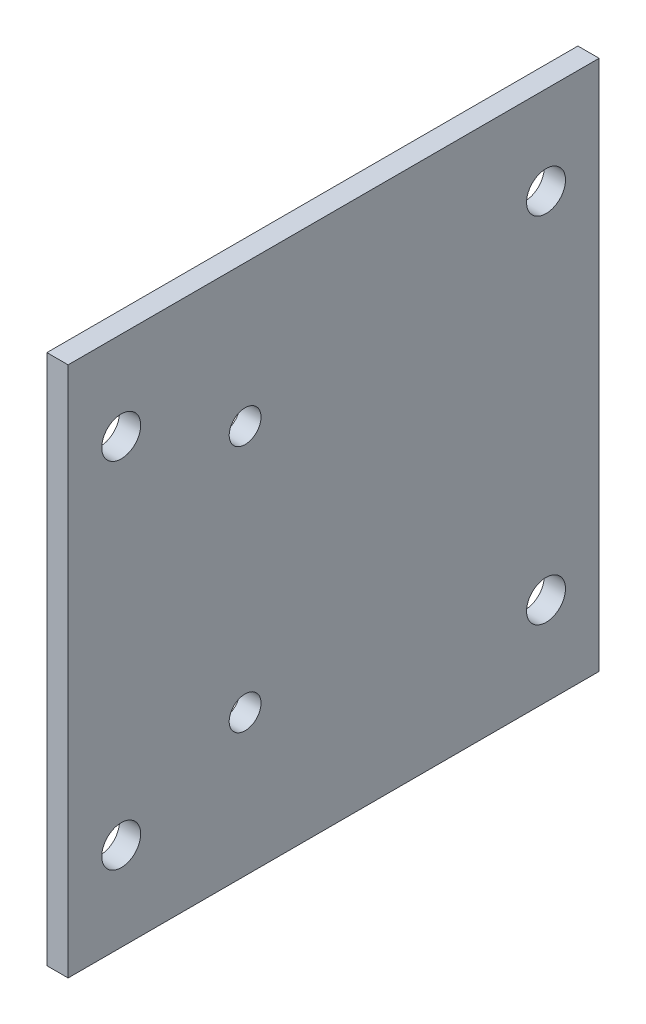
ISO-10303-21;
HEADER;
FILE_DESCRIPTION(('STEP AP214'),'2;1');
FILE_NAME('part.step','',(''),(''),'','','');
FILE_SCHEMA(('AUTOMOTIVE_DESIGN { 1 0 10303 214 1 1 1 1 }'));
ENDSEC;
DATA;
#1=APPLICATION_CONTEXT('core data for automotive mechanical design processes');
#2=APPLICATION_PROTOCOL_DEFINITION('international standard','automotive_design',2000,#1);
#3=PRODUCT_CONTEXT('',#1,'mechanical');
#4=PRODUCT('Part','Part','',(#3));
#5=PRODUCT_RELATED_PRODUCT_CATEGORY('part','',(#4));
#6=PRODUCT_DEFINITION_FORMATION('','',#4);
#7=PRODUCT_DEFINITION_CONTEXT('part definition',#1,'design');
#8=PRODUCT_DEFINITION('design','',#6,#7);
#9=PRODUCT_DEFINITION_SHAPE('','',#8);
#10=(LENGTH_UNIT() NAMED_UNIT(*) SI_UNIT(.MILLI.,.METRE.));
#11=(NAMED_UNIT(*) PLANE_ANGLE_UNIT() SI_UNIT($,.RADIAN.));
#12=(NAMED_UNIT(*) SI_UNIT($,.STERADIAN.) SOLID_ANGLE_UNIT());
#13=UNCERTAINTY_MEASURE_WITH_UNIT(LENGTH_MEASURE(1.E-05),#10,'distance_accuracy_value','');
#14=(GEOMETRIC_REPRESENTATION_CONTEXT(3) GLOBAL_UNCERTAINTY_ASSIGNED_CONTEXT((#13)) GLOBAL_UNIT_ASSIGNED_CONTEXT((#10,
#11,#12)) REPRESENTATION_CONTEXT('',''));
#15=CARTESIAN_POINT('',(0.,0.,0.));
#16=DIRECTION('',(0.,0.,1.));
#17=DIRECTION('',(1.,0.,0.));
#18=AXIS2_PLACEMENT_3D('',#15,#16,#17);
#19=CARTESIAN_POINT('',(3.,0.,0.));
#20=DIRECTION('',(-1.,0.,0.));
#21=DIRECTION('',(0.,0.,1.));
#22=AXIS2_PLACEMENT_3D('',#19,#20,#21);
#23=PLANE('',#22);
#24=DIRECTION('',(0.,1.,0.));
#25=VECTOR('',#24,1.);
#26=CARTESIAN_POINT('',(3.,107.5,-87.5));
#27=LINE('',#26,#25);
#28=CARTESIAN_POINT('',(3.,107.5,-87.5));
#29=VERTEX_POINT('',#28);
#30=CARTESIAN_POINT('',(3.,182.5,-87.5));
#31=VERTEX_POINT('',#30);
#32=EDGE_CURVE('E88',#29,#31,#27,.T.);
#33=ORIENTED_EDGE('',*,*,#32,.T.);
#34=DIRECTION('',(0.,0.,1.));
#35=VECTOR('',#34,1.);
#36=CARTESIAN_POINT('',(3.,182.5,-12.5));
#37=LINE('',#36,#35);
#38=CARTESIAN_POINT('',(3.,182.5,-12.5));
#39=VERTEX_POINT('',#38);
#40=EDGE_CURVE('E83',#31,#39,#37,.T.);
#41=ORIENTED_EDGE('',*,*,#40,.T.);
#42=DIRECTION('',(0.,-1.,0.));
#43=VECTOR('',#42,1.);
#44=CARTESIAN_POINT('',(3.,107.5,-12.5));
#45=LINE('',#44,#43);
#46=CARTESIAN_POINT('',(3.,107.5,-12.5));
#47=VERTEX_POINT('',#46);
#48=EDGE_CURVE('E86',#39,#47,#45,.T.);
#49=ORIENTED_EDGE('',*,*,#48,.T.);
#50=DIRECTION('',(0.,0.,-1.));
#51=VECTOR('',#50,1.);
#52=CARTESIAN_POINT('',(3.,107.5,-12.5));
#53=LINE('',#52,#51);
#54=EDGE_CURVE('E53',#47,#29,#53,.T.);
#55=ORIENTED_EDGE('',*,*,#54,.T.);
#56=EDGE_LOOP('',(#33,#41,#49,#55));
#57=FACE_BOUND('',#56,.T.);
#58=CARTESIAN_POINT('',(3.,170.,-19.9999999999999));
#59=DIRECTION('',(1.,0.,0.));
#60=DIRECTION('',(0.,0.,-1.));
#61=AXIS2_PLACEMENT_3D('',#58,#59,#60);
#62=CIRCLE('',#61,2.75);
#63=CARTESIAN_POINT('',(3.,170.,-22.7499999999999));
#64=VERTEX_POINT('',#63);
#65=EDGE_CURVE('E103',#64,#64,#62,.T.);
#66=ORIENTED_EDGE('',*,*,#65,.F.);
#67=EDGE_LOOP('',(#66));
#68=FACE_BOUND('',#67,.T.);
#69=CARTESIAN_POINT('',(3.,170.,-80.));
#70=DIRECTION('',(1.,0.,0.));
#71=DIRECTION('',(0.,0.,-1.));
#72=AXIS2_PLACEMENT_3D('',#69,#70,#71);
#73=CIRCLE('',#72,2.75000000000001);
#74=CARTESIAN_POINT('',(3.,170.,-82.75));
#75=VERTEX_POINT('',#74);
#76=EDGE_CURVE('E118',#75,#75,#73,.T.);
#77=ORIENTED_EDGE('',*,*,#76,.F.);
#78=EDGE_LOOP('',(#77));
#79=FACE_BOUND('',#78,.T.);
#80=CARTESIAN_POINT('',(3.,120.,-19.9999999999999));
#81=DIRECTION('',(1.,0.,0.));
#82=DIRECTION('',(0.,0.,-1.));
#83=AXIS2_PLACEMENT_3D('',#80,#81,#82);
#84=CIRCLE('',#83,2.75);
#85=CARTESIAN_POINT('',(3.,120.,-22.7499999999999));
#86=VERTEX_POINT('',#85);
#87=EDGE_CURVE('E124',#86,#86,#84,.T.);
#88=ORIENTED_EDGE('',*,*,#87,.F.);
#89=EDGE_LOOP('',(#88));
#90=FACE_BOUND('',#89,.T.);
#91=CARTESIAN_POINT('',(3.,127.5,-37.5));
#92=DIRECTION('',(1.,0.,0.));
#93=DIRECTION('',(0.,0.,-1.));
#94=AXIS2_PLACEMENT_3D('',#91,#92,#93);
#95=CIRCLE('',#94,2.25);
#96=CARTESIAN_POINT('',(3.,127.5,-39.75));
#97=VERTEX_POINT('',#96);
#98=EDGE_CURVE('E130',#97,#97,#95,.T.);
#99=ORIENTED_EDGE('',*,*,#98,.F.);
#100=EDGE_LOOP('',(#99));
#101=FACE_BOUND('',#100,.T.);
#102=CARTESIAN_POINT('',(3.,120.,-80.));
#103=DIRECTION('',(1.,0.,0.));
#104=DIRECTION('',(0.,0.,-1.));
#105=AXIS2_PLACEMENT_3D('',#102,#103,#104);
#106=CIRCLE('',#105,2.75000000000001);
#107=CARTESIAN_POINT('',(3.,120.,-82.75));
#108=VERTEX_POINT('',#107);
#109=EDGE_CURVE('E136',#108,#108,#106,.T.);
#110=ORIENTED_EDGE('',*,*,#109,.F.);
#111=EDGE_LOOP('',(#110));
#112=FACE_BOUND('',#111,.T.);
#113=CARTESIAN_POINT('',(3.,162.5,-37.5));
#114=DIRECTION('',(1.,0.,0.));
#115=DIRECTION('',(0.,0.,-1.));
#116=AXIS2_PLACEMENT_3D('',#113,#114,#115);
#117=CIRCLE('',#116,2.25);
#118=CARTESIAN_POINT('',(3.,162.5,-39.75));
#119=VERTEX_POINT('',#118);
#120=EDGE_CURVE('E142',#119,#119,#117,.T.);
#121=ORIENTED_EDGE('',*,*,#120,.F.);
#122=EDGE_LOOP('',(#121));
#123=FACE_BOUND('',#122,.T.);
#124=ADVANCED_FACE('F36',(#57,#68,#79,#90,#101,#112,#123),#23,.F.);
#125=CARTESIAN_POINT('',(0.,0.,0.));
#126=DIRECTION('',(-1.,0.,0.));
#127=DIRECTION('',(0.,0.,1.));
#128=AXIS2_PLACEMENT_3D('',#125,#126,#127);
#129=PLANE('',#128);
#130=CARTESIAN_POINT('',(0.,120.,-80.));
#131=DIRECTION('',(1.,0.,0.));
#132=DIRECTION('',(0.,0.,-1.));
#133=AXIS2_PLACEMENT_3D('',#130,#131,#132);
#134=CIRCLE('',#133,2.75000000000001);
#135=CARTESIAN_POINT('',(0.,120.,-82.75));
#136=VERTEX_POINT('',#135);
#137=EDGE_CURVE('E139',#136,#136,#134,.T.);
#138=ORIENTED_EDGE('',*,*,#137,.T.);
#139=EDGE_LOOP('',(#138));
#140=FACE_BOUND('',#139,.T.);
#141=CARTESIAN_POINT('',(0.,120.,-19.9999999999999));
#142=DIRECTION('',(1.,0.,0.));
#143=DIRECTION('',(0.,0.,-1.));
#144=AXIS2_PLACEMENT_3D('',#141,#142,#143);
#145=CIRCLE('',#144,2.75);
#146=CARTESIAN_POINT('',(0.,120.,-22.7499999999999));
#147=VERTEX_POINT('',#146);
#148=EDGE_CURVE('E127',#147,#147,#145,.T.);
#149=ORIENTED_EDGE('',*,*,#148,.T.);
#150=EDGE_LOOP('',(#149));
#151=FACE_BOUND('',#150,.T.);
#152=CARTESIAN_POINT('',(0.,170.,-19.9999999999999));
#153=DIRECTION('',(1.,0.,0.));
#154=DIRECTION('',(0.,0.,-1.));
#155=AXIS2_PLACEMENT_3D('',#152,#153,#154);
#156=CIRCLE('',#155,2.75);
#157=CARTESIAN_POINT('',(0.,170.,-22.7499999999999));
#158=VERTEX_POINT('',#157);
#159=EDGE_CURVE('E115',#158,#158,#156,.T.);
#160=ORIENTED_EDGE('',*,*,#159,.T.);
#161=EDGE_LOOP('',(#160));
#162=FACE_BOUND('',#161,.T.);
#163=DIRECTION('',(0.,1.,0.));
#164=VECTOR('',#163,1.);
#165=CARTESIAN_POINT('',(0.,107.5,-87.5));
#166=LINE('',#165,#164);
#167=CARTESIAN_POINT('',(0.,107.5,-87.5));
#168=VERTEX_POINT('',#167);
#169=CARTESIAN_POINT('',(0.,182.5,-87.5));
#170=VERTEX_POINT('',#169);
#171=EDGE_CURVE('E100',#168,#170,#166,.T.);
#172=ORIENTED_EDGE('',*,*,#171,.F.);
#173=DIRECTION('',(0.,0.,-1.));
#174=VECTOR('',#173,1.);
#175=CARTESIAN_POINT('',(0.,107.5,-12.5));
#176=LINE('',#175,#174);
#177=CARTESIAN_POINT('',(0.,107.5,-12.5));
#178=VERTEX_POINT('',#177);
#179=EDGE_CURVE('E76',#178,#168,#176,.T.);
#180=ORIENTED_EDGE('',*,*,#179,.F.);
#181=DIRECTION('',(0.,-1.,0.));
#182=VECTOR('',#181,1.);
#183=CARTESIAN_POINT('',(0.,107.5,-12.5));
#184=LINE('',#183,#182);
#185=CARTESIAN_POINT('',(0.,182.5,-12.5));
#186=VERTEX_POINT('',#185);
#187=EDGE_CURVE('E70',#186,#178,#184,.T.);
#188=ORIENTED_EDGE('',*,*,#187,.F.);
#189=DIRECTION('',(0.,0.,1.));
#190=VECTOR('',#189,1.);
#191=CARTESIAN_POINT('',(0.,182.5,-12.5));
#192=LINE('',#191,#190);
#193=EDGE_CURVE('E92',#170,#186,#192,.T.);
#194=ORIENTED_EDGE('',*,*,#193,.F.);
#195=EDGE_LOOP('',(#172,#180,#188,#194));
#196=FACE_BOUND('',#195,.T.);
#197=CARTESIAN_POINT('',(0.,170.,-80.));
#198=DIRECTION('',(1.,0.,0.));
#199=DIRECTION('',(0.,0.,-1.));
#200=AXIS2_PLACEMENT_3D('',#197,#198,#199);
#201=CIRCLE('',#200,2.75000000000001);
#202=CARTESIAN_POINT('',(0.,170.,-82.75));
#203=VERTEX_POINT('',#202);
#204=EDGE_CURVE('E121',#203,#203,#201,.T.);
#205=ORIENTED_EDGE('',*,*,#204,.T.);
#206=EDGE_LOOP('',(#205));
#207=FACE_BOUND('',#206,.T.);
#208=CARTESIAN_POINT('',(0.,127.5,-37.5));
#209=DIRECTION('',(1.,0.,0.));
#210=DIRECTION('',(0.,0.,-1.));
#211=AXIS2_PLACEMENT_3D('',#208,#209,#210);
#212=CIRCLE('',#211,2.25);
#213=CARTESIAN_POINT('',(0.,127.5,-39.75));
#214=VERTEX_POINT('',#213);
#215=EDGE_CURVE('E133',#214,#214,#212,.T.);
#216=ORIENTED_EDGE('',*,*,#215,.T.);
#217=EDGE_LOOP('',(#216));
#218=FACE_BOUND('',#217,.T.);
#219=CARTESIAN_POINT('',(0.,162.5,-37.5));
#220=DIRECTION('',(1.,0.,0.));
#221=DIRECTION('',(0.,0.,-1.));
#222=AXIS2_PLACEMENT_3D('',#219,#220,#221);
#223=CIRCLE('',#222,2.25);
#224=CARTESIAN_POINT('',(0.,162.5,-39.75));
#225=VERTEX_POINT('',#224);
#226=EDGE_CURVE('E145',#225,#225,#223,.T.);
#227=ORIENTED_EDGE('',*,*,#226,.T.);
#228=EDGE_LOOP('',(#227));
#229=FACE_BOUND('',#228,.T.);
#230=ADVANCED_FACE('F111',(#140,#151,#162,#196,#207,#218,#229),#129,.T.);
#231=CARTESIAN_POINT('',(3.,107.5,-87.5));
#232=DIRECTION('',(0.,0.,1.));
#233=DIRECTION('',(1.,0.,0.));
#234=AXIS2_PLACEMENT_3D('',#231,#232,#233);
#235=PLANE('',#234);
#236=ORIENTED_EDGE('',*,*,#171,.T.);
#237=DIRECTION('',(-1.,0.,0.));
#238=VECTOR('',#237,1.);
#239=CARTESIAN_POINT('',(3.,182.5,-87.5));
#240=LINE('',#239,#238);
#241=EDGE_CURVE('E11',#31,#170,#240,.T.);
#242=ORIENTED_EDGE('',*,*,#241,.F.);
#243=ORIENTED_EDGE('',*,*,#32,.F.);
#244=DIRECTION('',(-1.,0.,0.));
#245=VECTOR('',#244,1.);
#246=CARTESIAN_POINT('',(3.,107.5,-87.5));
#247=LINE('',#246,#245);
#248=EDGE_CURVE('E96',#29,#168,#247,.T.);
#249=ORIENTED_EDGE('',*,*,#248,.T.);
#250=EDGE_LOOP('',(#236,#242,#243,#249));
#251=FACE_BOUND('',#250,.T.);
#252=ADVANCED_FACE('F38',(#251),#235,.F.);
#253=CARTESIAN_POINT('',(3.,182.5,-12.5));
#254=DIRECTION('',(0.,-1.,0.));
#255=DIRECTION('',(0.,0.,-1.));
#256=AXIS2_PLACEMENT_3D('',#253,#254,#255);
#257=PLANE('',#256);
#258=ORIENTED_EDGE('',*,*,#193,.T.);
#259=DIRECTION('',(-1.,0.,0.));
#260=VECTOR('',#259,1.);
#261=CARTESIAN_POINT('',(3.,182.5,-12.5));
#262=LINE('',#261,#260);
#263=EDGE_CURVE('E45',#39,#186,#262,.T.);
#264=ORIENTED_EDGE('',*,*,#263,.F.);
#265=ORIENTED_EDGE('',*,*,#40,.F.);
#266=ORIENTED_EDGE('',*,*,#241,.T.);
#267=EDGE_LOOP('',(#258,#264,#265,#266));
#268=FACE_BOUND('',#267,.T.);
#269=ADVANCED_FACE('F91',(#268),#257,.F.);
#270=CARTESIAN_POINT('',(3.,107.5,-12.5));
#271=DIRECTION('',(0.,0.,-1.));
#272=DIRECTION('',(-1.,0.,0.));
#273=AXIS2_PLACEMENT_3D('',#270,#271,#272);
#274=PLANE('',#273);
#275=ORIENTED_EDGE('',*,*,#187,.T.);
#276=DIRECTION('',(-1.,0.,0.));
#277=VECTOR('',#276,1.);
#278=CARTESIAN_POINT('',(3.,107.5,-12.5));
#279=LINE('',#278,#277);
#280=EDGE_CURVE('E93',#47,#178,#279,.T.);
#281=ORIENTED_EDGE('',*,*,#280,.F.);
#282=ORIENTED_EDGE('',*,*,#48,.F.);
#283=ORIENTED_EDGE('',*,*,#263,.T.);
#284=EDGE_LOOP('',(#275,#281,#282,#283));
#285=FACE_BOUND('',#284,.T.);
#286=ADVANCED_FACE('F94',(#285),#274,.F.);
#287=CARTESIAN_POINT('',(3.,107.5,-12.5));
#288=DIRECTION('',(0.,1.,0.));
#289=DIRECTION('',(0.,0.,1.));
#290=AXIS2_PLACEMENT_3D('',#287,#288,#289);
#291=PLANE('',#290);
#292=ORIENTED_EDGE('',*,*,#179,.T.);
#293=ORIENTED_EDGE('',*,*,#248,.F.);
#294=ORIENTED_EDGE('',*,*,#54,.F.);
#295=ORIENTED_EDGE('',*,*,#280,.T.);
#296=EDGE_LOOP('',(#292,#293,#294,#295));
#297=FACE_BOUND('',#296,.T.);
#298=ADVANCED_FACE('F108',(#297),#291,.F.);
#299=CARTESIAN_POINT('',(3.,170.,-19.9999999999999));
#300=DIRECTION('',(-1.,0.,0.));
#301=DIRECTION('',(0.,0.,1.));
#302=AXIS2_PLACEMENT_3D('',#299,#300,#301);
#303=CYLINDRICAL_SURFACE('',#302,2.75);
#304=ORIENTED_EDGE('',*,*,#65,.T.);
#305=EDGE_LOOP('',(#304));
#306=FACE_BOUND('',#305,.T.);
#307=ORIENTED_EDGE('',*,*,#159,.F.);
#308=EDGE_LOOP('',(#307));
#309=FACE_BOUND('',#308,.T.);
#310=ADVANCED_FACE('F162',(#306,#309),#303,.F.);
#311=CARTESIAN_POINT('',(3.,170.,-80.));
#312=DIRECTION('',(-1.,0.,0.));
#313=DIRECTION('',(0.,0.,1.));
#314=AXIS2_PLACEMENT_3D('',#311,#312,#313);
#315=CYLINDRICAL_SURFACE('',#314,2.75000000000001);
#316=ORIENTED_EDGE('',*,*,#76,.T.);
#317=EDGE_LOOP('',(#316));
#318=FACE_BOUND('',#317,.T.);
#319=ORIENTED_EDGE('',*,*,#204,.F.);
#320=EDGE_LOOP('',(#319));
#321=FACE_BOUND('',#320,.T.);
#322=ADVANCED_FACE('F216',(#318,#321),#315,.F.);
#323=CARTESIAN_POINT('',(3.,120.,-19.9999999999999));
#324=DIRECTION('',(-1.,0.,0.));
#325=DIRECTION('',(0.,0.,1.));
#326=AXIS2_PLACEMENT_3D('',#323,#324,#325);
#327=CYLINDRICAL_SURFACE('',#326,2.75);
#328=ORIENTED_EDGE('',*,*,#87,.T.);
#329=EDGE_LOOP('',(#328));
#330=FACE_BOUND('',#329,.T.);
#331=ORIENTED_EDGE('',*,*,#148,.F.);
#332=EDGE_LOOP('',(#331));
#333=FACE_BOUND('',#332,.T.);
#334=ADVANCED_FACE('F225',(#330,#333),#327,.F.);
#335=CARTESIAN_POINT('',(3.,127.5,-37.5));
#336=DIRECTION('',(-1.,0.,0.));
#337=DIRECTION('',(0.,0.,1.));
#338=AXIS2_PLACEMENT_3D('',#335,#336,#337);
#339=CYLINDRICAL_SURFACE('',#338,2.25);
#340=ORIENTED_EDGE('',*,*,#98,.T.);
#341=EDGE_LOOP('',(#340));
#342=FACE_BOUND('',#341,.T.);
#343=ORIENTED_EDGE('',*,*,#215,.F.);
#344=EDGE_LOOP('',(#343));
#345=FACE_BOUND('',#344,.T.);
#346=ADVANCED_FACE('F234',(#342,#345),#339,.F.);
#347=CARTESIAN_POINT('',(3.,120.,-80.));
#348=DIRECTION('',(-1.,0.,0.));
#349=DIRECTION('',(0.,0.,1.));
#350=AXIS2_PLACEMENT_3D('',#347,#348,#349);
#351=CYLINDRICAL_SURFACE('',#350,2.75000000000001);
#352=ORIENTED_EDGE('',*,*,#109,.T.);
#353=EDGE_LOOP('',(#352));
#354=FACE_BOUND('',#353,.T.);
#355=ORIENTED_EDGE('',*,*,#137,.F.);
#356=EDGE_LOOP('',(#355));
#357=FACE_BOUND('',#356,.T.);
#358=ADVANCED_FACE('F244',(#354,#357),#351,.F.);
#359=CARTESIAN_POINT('',(3.,162.5,-37.5));
#360=DIRECTION('',(-1.,0.,0.));
#361=DIRECTION('',(0.,0.,1.));
#362=AXIS2_PLACEMENT_3D('',#359,#360,#361);
#363=CYLINDRICAL_SURFACE('',#362,2.25);
#364=ORIENTED_EDGE('',*,*,#120,.T.);
#365=EDGE_LOOP('',(#364));
#366=FACE_BOUND('',#365,.T.);
#367=ORIENTED_EDGE('',*,*,#226,.F.);
#368=EDGE_LOOP('',(#367));
#369=FACE_BOUND('',#368,.T.);
#370=ADVANCED_FACE('F151',(#366,#369),#363,.F.);
#371=CLOSED_SHELL('',(#124,#230,#252,#269,#286,#298,#310,#322,#334,#346,#358,#370));
#372=MANIFOLD_SOLID_BREP('B2',#371);
#373=ADVANCED_BREP_SHAPE_REPRESENTATION('',(#18,#372),#14);
#374=SHAPE_DEFINITION_REPRESENTATION(#9,#373);
ENDSEC;
END-ISO-10303-21;
